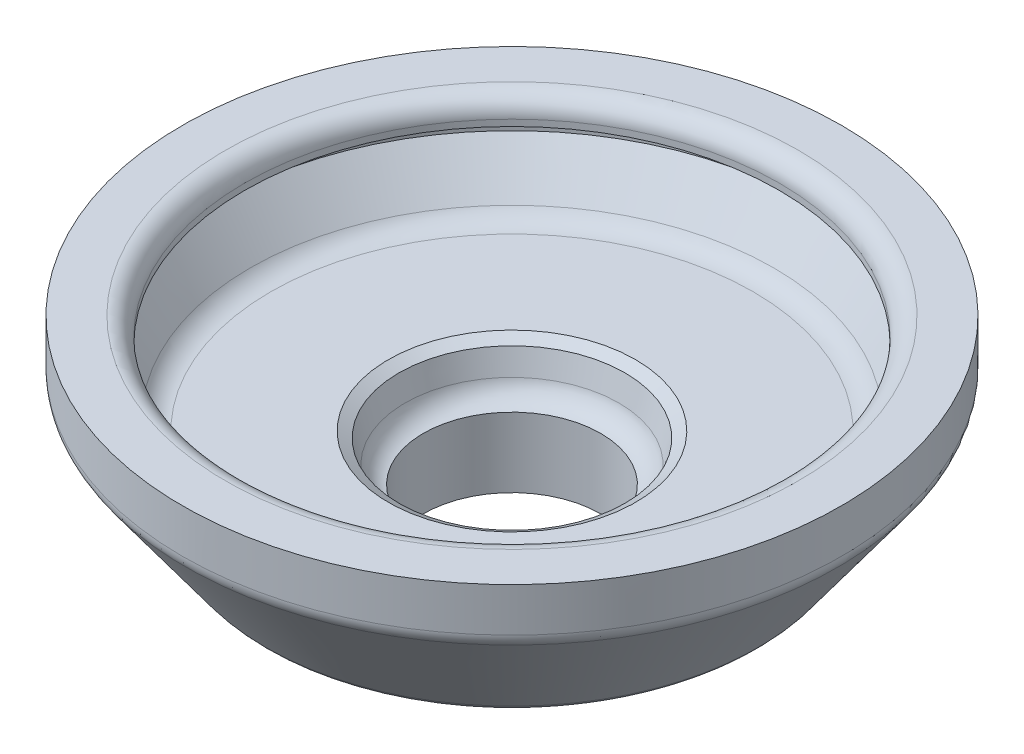
ISO-10303-21;
HEADER;
FILE_DESCRIPTION(('STEP AP214'),'2;1');
FILE_NAME('part.step','',(''),(''),'','','');
FILE_SCHEMA(('AUTOMOTIVE_DESIGN { 1 0 10303 214 1 1 1 1 }'));
ENDSEC;
DATA;
#1=APPLICATION_CONTEXT('core data for automotive mechanical design processes');
#2=APPLICATION_PROTOCOL_DEFINITION('international standard','automotive_design',2000,#1);
#3=PRODUCT_CONTEXT('',#1,'mechanical');
#4=PRODUCT('Part','Part','',(#3));
#5=PRODUCT_RELATED_PRODUCT_CATEGORY('part','',(#4));
#6=PRODUCT_DEFINITION_FORMATION('','',#4);
#7=PRODUCT_DEFINITION_CONTEXT('part definition',#1,'design');
#8=PRODUCT_DEFINITION('design','',#6,#7);
#9=PRODUCT_DEFINITION_SHAPE('','',#8);
#10=(LENGTH_UNIT() NAMED_UNIT(*) SI_UNIT(.MILLI.,.METRE.));
#11=(NAMED_UNIT(*) PLANE_ANGLE_UNIT() SI_UNIT($,.RADIAN.));
#12=(NAMED_UNIT(*) SI_UNIT($,.STERADIAN.) SOLID_ANGLE_UNIT());
#13=UNCERTAINTY_MEASURE_WITH_UNIT(LENGTH_MEASURE(1.E-05),#10,'distance_accuracy_value','');
#14=(GEOMETRIC_REPRESENTATION_CONTEXT(3) GLOBAL_UNCERTAINTY_ASSIGNED_CONTEXT((#13)) GLOBAL_UNIT_ASSIGNED_CONTEXT((#10,
#11,#12)) REPRESENTATION_CONTEXT('',''));
#15=CARTESIAN_POINT('',(0.,0.,0.));
#16=DIRECTION('',(0.,0.,1.));
#17=DIRECTION('',(1.,0.,0.));
#18=AXIS2_PLACEMENT_3D('',#15,#16,#17);
#19=CARTESIAN_POINT('',(-0.00251993502765717,10.2500265590013,0.));
#20=DIRECTION('',(0.,-1.,0.));
#21=DIRECTION('',(0.,0.,-1.));
#22=AXIS2_PLACEMENT_3D('',#19,#20,#21);
#23=TOROIDAL_SURFACE('',#22,3.2978087736099,0.950029759863165);
#24=CARTESIAN_POINT('',(-0.00251993502765717,10.0041406776896,0.));
#25=DIRECTION('',(0.,-1.,0.));
#26=DIRECTION('',(0.,0.,-1.));
#27=AXIS2_PLACEMENT_3D('',#24,#25,#26);
#28=CIRCLE('',#27,4.21546703134927);
#29=CARTESIAN_POINT('',(-0.00251993502765717,10.0041406776896,-4.21546703134927));
#30=VERTEX_POINT('',#29);
#31=EDGE_CURVE('E89',#30,#30,#28,.T.);
#32=ORIENTED_EDGE('',*,*,#31,.F.);
#33=EDGE_LOOP('',(#32));
#34=FACE_BOUND('',#33,.T.);
#35=CARTESIAN_POINT('',(-0.00251993502765717,9.32176191322588,0.));
#36=DIRECTION('',(0.,-1.,0.));
#37=DIRECTION('',(0.,0.,-1.));
#38=AXIS2_PLACEMENT_3D('',#35,#36,#37);
#39=CIRCLE('',#38,3.5);
#40=CARTESIAN_POINT('',(-0.00251993502765717,9.32176191322588,-3.5));
#41=VERTEX_POINT('',#40);
#42=EDGE_CURVE('E107',#41,#41,#39,.T.);
#43=ORIENTED_EDGE('',*,*,#42,.T.);
#44=EDGE_LOOP('',(#43));
#45=FACE_BOUND('',#44,.T.);
#46=ADVANCED_FACE('F39',(#34,#45),#23,.F.);
#47=CARTESIAN_POINT('',(-0.00251993502765717,10.0041406776896,0.));
#48=DIRECTION('',(0.,1.,0.));
#49=DIRECTION('',(0.,0.,1.));
#50=AXIS2_PLACEMENT_3D('',#47,#48,#49);
#51=CONICAL_SURFACE('',#50,4.21546703134927,0.261799481564869);
#52=CARTESIAN_POINT('',(-0.00251993502765717,10.9106206548614,0.));
#53=DIRECTION('',(0.,-1.,0.));
#54=DIRECTION('',(0.,0.,-1.));
#55=AXIS2_PLACEMENT_3D('',#52,#53,#54);
#56=CIRCLE('',#55,4.45835770028667);
#57=CARTESIAN_POINT('',(-0.00251993502765717,10.9106206548614,-4.45835770028667));
#58=VERTEX_POINT('',#57);
#59=EDGE_CURVE('E50',#58,#58,#56,.F.);
#60=ORIENTED_EDGE('',*,*,#59,.T.);
#61=EDGE_LOOP('',(#60));
#62=FACE_BOUND('',#61,.T.);
#63=ORIENTED_EDGE('',*,*,#31,.T.);
#64=EDGE_LOOP('',(#63));
#65=FACE_BOUND('',#64,.T.);
#66=ADVANCED_FACE('F130',(#62,#65),#51,.F.);
#67=CARTESIAN_POINT('',(-10.0255824192326,11.1521021053666,0.));
#68=DIRECTION('',(0.,-1.,0.));
#69=DIRECTION('',(0.,0.,-1.));
#70=AXIS2_PLACEMENT_3D('',#67,#68,#69);
#71=PLANE('',#70);
#72=CARTESIAN_POINT('',(-0.00251993502765717,11.1521021053666,0.));
#73=DIRECTION('',(0.,-1.,0.));
#74=DIRECTION('',(0.,0.,-1.));
#75=AXIS2_PLACEMENT_3D('',#72,#73,#74);
#76=CIRCLE('',#75,4.8766159322178);
#77=CARTESIAN_POINT('',(-0.00251993502765717,11.1521021053666,-4.8766159322178));
#78=VERTEX_POINT('',#77);
#79=EDGE_CURVE('E54',#78,#78,#76,.T.);
#80=ORIENTED_EDGE('',*,*,#79,.T.);
#81=EDGE_LOOP('',(#80));
#82=FACE_BOUND('',#81,.T.);
#83=CARTESIAN_POINT('',(-0.00251993502765717,11.1521021053666,0.));
#84=DIRECTION('',(0.,-1.,0.));
#85=DIRECTION('',(0.,0.,-1.));
#86=AXIS2_PLACEMENT_3D('',#83,#84,#85);
#87=CIRCLE('',#86,9.51427070773984);
#88=CARTESIAN_POINT('',(-0.00251993502765717,11.1521021053666,-9.51427070773984));
#89=VERTEX_POINT('',#88);
#90=EDGE_CURVE('E59',#89,#89,#87,.F.);
#91=ORIENTED_EDGE('',*,*,#90,.T.);
#92=EDGE_LOOP('',(#91));
#93=FACE_BOUND('',#92,.T.);
#94=ADVANCED_FACE('F137',(#82,#93),#71,.F.);
#95=CARTESIAN_POINT('',(-0.00251993502765717,11.1521021053666,0.));
#96=DIRECTION('',(0.,1.,0.));
#97=DIRECTION('',(0.,0.,1.));
#98=AXIS2_PLACEMENT_3D('',#95,#96,#97);
#99=CONICAL_SURFACE('',#98,10.023062484205,0.629483791624657);
#100=CARTESIAN_POINT('',(-0.00251993502765717,11.5633745364681,0.));
#101=DIRECTION('',(0.,1.,0.));
#102=DIRECTION('',(0.,0.,1.));
#103=AXIS2_PLACEMENT_3D('',#100,#101,#102);
#104=CIRCLE('',#103,10.3226022298388);
#105=CARTESIAN_POINT('',(-0.00251993502765717,11.5633745364681,10.3226022298388));
#106=VERTEX_POINT('',#105);
#107=EDGE_CURVE('E62',#106,#106,#104,.F.);
#108=ORIENTED_EDGE('',*,*,#107,.T.);
#109=EDGE_LOOP('',(#108));
#110=FACE_BOUND('',#109,.T.);
#111=CARTESIAN_POINT('',(-0.00251993502765717,13.2451496344329,0.));
#112=DIRECTION('',(0.,-1.,0.));
#113=DIRECTION('',(0.,0.,-1.));
#114=AXIS2_PLACEMENT_3D('',#111,#112,#113);
#115=CIRCLE('',#114,11.5474800649723);
#116=CARTESIAN_POINT('',(-0.00251993502765717,13.2451496344329,-11.5474800649723));
#117=VERTEX_POINT('',#116);
#118=EDGE_CURVE('E92',#117,#117,#115,.T.);
#119=ORIENTED_EDGE('',*,*,#118,.F.);
#120=EDGE_LOOP('',(#119));
#121=FACE_BOUND('',#120,.T.);
#122=ADVANCED_FACE('F176',(#110,#121),#99,.F.);
#123=CARTESIAN_POINT('',(-0.00251993502765717,0.,0.));
#124=DIRECTION('',(0.,-1.,0.));
#125=DIRECTION('',(0.,0.,-1.));
#126=AXIS2_PLACEMENT_3D('',#123,#124,#125);
#127=CYLINDRICAL_SURFACE('',#126,11.5474800649723);
#128=CARTESIAN_POINT('',(-0.00251993502765717,14.0951496344329,0.));
#129=DIRECTION('',(0.,-1.,0.));
#130=DIRECTION('',(0.,0.,-1.));
#131=AXIS2_PLACEMENT_3D('',#128,#129,#130);
#132=CIRCLE('',#131,11.5474800649723);
#133=CARTESIAN_POINT('',(-0.00251993502765717,14.0951496344329,-11.5474800649723));
#134=VERTEX_POINT('',#133);
#135=EDGE_CURVE('E95',#134,#134,#132,.T.);
#136=ORIENTED_EDGE('',*,*,#135,.F.);
#137=EDGE_LOOP('',(#136));
#138=FACE_BOUND('',#137,.T.);
#139=ORIENTED_EDGE('',*,*,#118,.T.);
#140=EDGE_LOOP('',(#139));
#141=FACE_BOUND('',#140,.T.);
#142=ADVANCED_FACE('F183',(#138,#141),#127,.F.);
#143=CARTESIAN_POINT('',(-10.55,14.0951496344329,0.));
#144=DIRECTION('',(0.,1.,0.));
#145=DIRECTION('',(0.,0.,1.));
#146=AXIS2_PLACEMENT_3D('',#143,#144,#145);
#147=PLANE('',#146);
#148=CARTESIAN_POINT('',(-0.00251993502765717,14.0951496344329,0.));
#149=DIRECTION('',(0.,-1.,0.));
#150=DIRECTION('',(0.,0.,-1.));
#151=AXIS2_PLACEMENT_3D('',#148,#149,#150);
#152=CIRCLE('',#151,10.5474800649723);
#153=CARTESIAN_POINT('',(-0.00251993502765717,14.0951496344329,-10.5474800649723));
#154=VERTEX_POINT('',#153);
#155=EDGE_CURVE('E98',#154,#154,#152,.T.);
#156=ORIENTED_EDGE('',*,*,#155,.F.);
#157=EDGE_LOOP('',(#156));
#158=FACE_BOUND('',#157,.T.);
#159=ORIENTED_EDGE('',*,*,#135,.T.);
#160=EDGE_LOOP('',(#159));
#161=FACE_BOUND('',#160,.T.);
#162=ADVANCED_FACE('F187',(#158,#161),#147,.F.);
#163=CARTESIAN_POINT('',(-0.00251993502765717,0.,0.));
#164=DIRECTION('',(0.,-1.,0.));
#165=DIRECTION('',(0.,0.,-1.));
#166=AXIS2_PLACEMENT_3D('',#163,#164,#165);
#167=CYLINDRICAL_SURFACE('',#166,10.5474800649723);
#168=CARTESIAN_POINT('',(-0.00251993502765717,14.3451496344329,0.));
#169=DIRECTION('',(0.,-1.,0.));
#170=DIRECTION('',(0.,0.,-1.));
#171=AXIS2_PLACEMENT_3D('',#168,#169,#170);
#172=CIRCLE('',#171,10.5474800649723);
#173=CARTESIAN_POINT('',(-0.00251993502765717,14.3451496344329,-10.5474800649723));
#174=VERTEX_POINT('',#173);
#175=EDGE_CURVE('E65',#174,#174,#172,.F.);
#176=ORIENTED_EDGE('',*,*,#175,.T.);
#177=EDGE_LOOP('',(#176));
#178=FACE_BOUND('',#177,.T.);
#179=ORIENTED_EDGE('',*,*,#155,.T.);
#180=EDGE_LOOP('',(#179));
#181=FACE_BOUND('',#180,.T.);
#182=ADVANCED_FACE('F193',(#178,#181),#167,.F.);
#183=CARTESIAN_POINT('',(-13.,15.0951496344329,0.));
#184=DIRECTION('',(0.,-1.,0.));
#185=DIRECTION('',(0.,0.,-1.));
#186=AXIS2_PLACEMENT_3D('',#183,#184,#185);
#187=PLANE('',#186);
#188=CARTESIAN_POINT('',(-0.00251993502765717,15.0951496344329,0.));
#189=DIRECTION('',(0.,-1.,0.));
#190=DIRECTION('',(0.,0.,-1.));
#191=AXIS2_PLACEMENT_3D('',#188,#189,#190);
#192=CIRCLE('',#191,11.2974800649723);
#193=CARTESIAN_POINT('',(-0.00251993502765717,15.0951496344329,-11.2974800649723));
#194=VERTEX_POINT('',#193);
#195=EDGE_CURVE('E68',#194,#194,#192,.T.);
#196=ORIENTED_EDGE('',*,*,#195,.T.);
#197=EDGE_LOOP('',(#196));
#198=FACE_BOUND('',#197,.T.);
#199=CARTESIAN_POINT('',(-0.00251993502765717,15.0951496344329,0.));
#200=DIRECTION('',(0.,-1.,0.));
#201=DIRECTION('',(0.,0.,-1.));
#202=AXIS2_PLACEMENT_3D('',#199,#200,#201);
#203=CIRCLE('',#202,12.9974800649723);
#204=CARTESIAN_POINT('',(-0.00251993502765717,15.0951496344329,-12.9974800649723));
#205=VERTEX_POINT('',#204);
#206=EDGE_CURVE('E101',#205,#205,#203,.T.);
#207=ORIENTED_EDGE('',*,*,#206,.F.);
#208=EDGE_LOOP('',(#207));
#209=FACE_BOUND('',#208,.T.);
#210=ADVANCED_FACE('F200',(#198,#209),#187,.F.);
#211=CARTESIAN_POINT('',(-0.00251993502765717,0.,0.));
#212=DIRECTION('',(0.,-1.,0.));
#213=DIRECTION('',(0.,0.,-1.));
#214=AXIS2_PLACEMENT_3D('',#211,#212,#213);
#215=CYLINDRICAL_SURFACE('',#214,12.9974800649723);
#216=CARTESIAN_POINT('',(-0.00251993502765717,13.3680259236142,0.));
#217=DIRECTION('',(0.,1.,0.));
#218=DIRECTION('',(0.,0.,1.));
#219=AXIS2_PLACEMENT_3D('',#216,#217,#218);
#220=CIRCLE('',#219,12.9974800649723);
#221=CARTESIAN_POINT('',(-0.00251993502765717,13.3680259236142,12.9974800649723));
#222=VERTEX_POINT('',#221);
#223=EDGE_CURVE('E71',#222,#222,#220,.T.);
#224=ORIENTED_EDGE('',*,*,#223,.T.);
#225=EDGE_LOOP('',(#224));
#226=FACE_BOUND('',#225,.T.);
#227=ORIENTED_EDGE('',*,*,#206,.T.);
#228=EDGE_LOOP('',(#227));
#229=FACE_BOUND('',#228,.T.);
#230=ADVANCED_FACE('F204',(#226,#229),#215,.T.);
#231=CARTESIAN_POINT('',(-0.00251993502765717,13.1238529546215,0.));
#232=DIRECTION('',(0.,1.,0.));
#233=DIRECTION('',(0.,0.,1.));
#234=AXIS2_PLACEMENT_3D('',#231,#232,#233);
#235=CONICAL_SURFACE('',#234,12.9974800649723,0.629483791624657);
#236=CARTESIAN_POINT('',(-0.00251993502765717,8.63021623655202,0.));
#237=DIRECTION('',(0.,-1.,0.));
#238=DIRECTION('',(0.,0.,-1.));
#239=AXIS2_PLACEMENT_3D('',#236,#237,#238);
#240=CIRCLE('',#239,9.7246548092254);
#241=CARTESIAN_POINT('',(-0.00251993502765717,8.63021623655202,-9.7246548092254));
#242=VERTEX_POINT('',#241);
#243=EDGE_CURVE('E74',#242,#242,#240,.F.);
#244=ORIENTED_EDGE('',*,*,#243,.T.);
#245=EDGE_LOOP('',(#244));
#246=FACE_BOUND('',#245,.T.);
#247=CARTESIAN_POINT('',(-0.00251993502765717,12.9264802469403,0.));
#248=DIRECTION('',(0.,-1.,0.));
#249=DIRECTION('',(0.,0.,-1.));
#250=AXIS2_PLACEMENT_3D('',#247,#248,#249);
#251=CIRCLE('',#250,12.8537287065466);
#252=CARTESIAN_POINT('',(-0.00251993502765717,12.9264802469403,-12.8537287065466));
#253=VERTEX_POINT('',#252);
#254=EDGE_CURVE('E77',#253,#253,#251,.T.);
#255=ORIENTED_EDGE('',*,*,#254,.T.);
#256=EDGE_LOOP('',(#255));
#257=FACE_BOUND('',#256,.T.);
#258=ADVANCED_FACE('F208',(#246,#257),#235,.T.);
#259=CARTESIAN_POINT('',(-4.50251993502766,8.32176191322588,0.));
#260=DIRECTION('',(0.,1.,0.));
#261=DIRECTION('',(0.,0.,1.));
#262=AXIS2_PLACEMENT_3D('',#259,#260,#261);
#263=PLANE('',#262);
#264=CARTESIAN_POINT('',(-0.00251993502765717,8.32176191322588,0.));
#265=DIRECTION('',(0.,1.,0.));
#266=DIRECTION('',(0.,0.,1.));
#267=AXIS2_PLACEMENT_3D('',#264,#265,#266);
#268=CIRCLE('',#267,5.25);
#269=CARTESIAN_POINT('',(-0.00251993502765717,8.32176191322588,5.25));
#270=VERTEX_POINT('',#269);
#271=EDGE_CURVE('E80',#270,#270,#268,.T.);
#272=ORIENTED_EDGE('',*,*,#271,.T.);
#273=EDGE_LOOP('',(#272));
#274=FACE_BOUND('',#273,.T.);
#275=CARTESIAN_POINT('',(-0.00251993502765717,8.32176191322588,0.));
#276=DIRECTION('',(0.,1.,0.));
#277=DIRECTION('',(0.,0.,1.));
#278=AXIS2_PLACEMENT_3D('',#275,#276,#277);
#279=CIRCLE('',#278,9.11840616765114);
#280=CARTESIAN_POINT('',(-0.00251993502765717,8.32176191322588,9.11840616765114));
#281=VERTEX_POINT('',#280);
#282=EDGE_CURVE('E83',#281,#281,#279,.F.);
#283=ORIENTED_EDGE('',*,*,#282,.T.);
#284=EDGE_LOOP('',(#283));
#285=FACE_BOUND('',#284,.T.);
#286=ADVANCED_FACE('F127',(#274,#285),#263,.F.);
#287=CARTESIAN_POINT('',(-0.00251993502765717,0.,0.));
#288=DIRECTION('',(0.,-1.,0.));
#289=DIRECTION('',(0.,0.,-1.));
#290=AXIS2_PLACEMENT_3D('',#287,#288,#289);
#291=CYLINDRICAL_SURFACE('',#290,4.5);
#292=CARTESIAN_POINT('',(-0.00251993502765717,6.78176191322588,0.));
#293=DIRECTION('',(0.,1.,0.));
#294=DIRECTION('',(0.,0.,1.));
#295=AXIS2_PLACEMENT_3D('',#292,#293,#294);
#296=CIRCLE('',#295,4.5);
#297=CARTESIAN_POINT('',(-0.00251993502765717,6.78176191322588,4.5));
#298=VERTEX_POINT('',#297);
#299=EDGE_CURVE('E10',#298,#298,#296,.T.);
#300=ORIENTED_EDGE('',*,*,#299,.T.);
#301=EDGE_LOOP('',(#300));
#302=FACE_BOUND('',#301,.T.);
#303=CARTESIAN_POINT('',(-0.00251993502765717,7.57176191322588,0.));
#304=DIRECTION('',(0.,1.,0.));
#305=DIRECTION('',(0.,0.,1.));
#306=AXIS2_PLACEMENT_3D('',#303,#304,#305);
#307=CIRCLE('',#306,4.5);
#308=CARTESIAN_POINT('',(-0.00251993502765717,7.57176191322588,4.5));
#309=VERTEX_POINT('',#308);
#310=EDGE_CURVE('E86',#309,#309,#307,.F.);
#311=ORIENTED_EDGE('',*,*,#310,.T.);
#312=EDGE_LOOP('',(#311));
#313=FACE_BOUND('',#312,.T.);
#314=ADVANCED_FACE('F121',(#302,#313),#291,.T.);
#315=CARTESIAN_POINT('',(-4.50251993502766,6.57176191322588,0.));
#316=DIRECTION('',(0.,1.,0.));
#317=DIRECTION('',(0.,0.,1.));
#318=AXIS2_PLACEMENT_3D('',#315,#316,#317);
#319=PLANE('',#318);
#320=CARTESIAN_POINT('',(-0.00251993502765717,6.57176191322588,0.));
#321=DIRECTION('',(0.,1.,0.));
#322=DIRECTION('',(0.,0.,1.));
#323=AXIS2_PLACEMENT_3D('',#320,#321,#322);
#324=CIRCLE('',#323,4.29);
#325=CARTESIAN_POINT('',(-0.00251993502765717,6.57176191322588,4.29));
#326=VERTEX_POINT('',#325);
#327=EDGE_CURVE('E46',#326,#326,#324,.F.);
#328=ORIENTED_EDGE('',*,*,#327,.T.);
#329=EDGE_LOOP('',(#328));
#330=FACE_BOUND('',#329,.T.);
#331=CARTESIAN_POINT('',(-0.00251993502765717,6.57176191322588,0.));
#332=DIRECTION('',(0.,-1.,0.));
#333=DIRECTION('',(0.,0.,-1.));
#334=AXIS2_PLACEMENT_3D('',#331,#332,#333);
#335=CIRCLE('',#334,3.5);
#336=CARTESIAN_POINT('',(-0.00251993502765717,6.57176191322588,-3.5));
#337=VERTEX_POINT('',#336);
#338=EDGE_CURVE('E104',#337,#337,#335,.T.);
#339=ORIENTED_EDGE('',*,*,#338,.F.);
#340=EDGE_LOOP('',(#339));
#341=FACE_BOUND('',#340,.T.);
#342=ADVANCED_FACE('F116',(#330,#341),#319,.F.);
#343=CARTESIAN_POINT('',(-0.00251993502765717,0.,0.));
#344=DIRECTION('',(0.,-1.,0.));
#345=DIRECTION('',(0.,0.,-1.));
#346=AXIS2_PLACEMENT_3D('',#343,#344,#345);
#347=CYLINDRICAL_SURFACE('',#346,3.5);
#348=ORIENTED_EDGE('',*,*,#42,.F.);
#349=EDGE_LOOP('',(#348));
#350=FACE_BOUND('',#349,.T.);
#351=ORIENTED_EDGE('',*,*,#338,.T.);
#352=EDGE_LOOP('',(#351));
#353=FACE_BOUND('',#352,.T.);
#354=ADVANCED_FACE('F112',(#350,#353),#347,.F.);
#355=CARTESIAN_POINT('',(-0.00251993502765717,7.57176191322588,0.));
#356=DIRECTION('',(0.,1.,0.));
#357=DIRECTION('',(0.,0.,1.));
#358=AXIS2_PLACEMENT_3D('',#355,#356,#357);
#359=TOROIDAL_SURFACE('',#358,5.25,0.75);
#360=ORIENTED_EDGE('',*,*,#271,.F.);
#361=EDGE_LOOP('',(#360));
#362=FACE_BOUND('',#361,.T.);
#363=ORIENTED_EDGE('',*,*,#310,.F.);
#364=EDGE_LOOP('',(#363));
#365=FACE_BOUND('',#364,.T.);
#366=ADVANCED_FACE('F115',(#362,#365),#359,.F.);
#367=CARTESIAN_POINT('',(-0.00251993502765717,9.07176191322588,0.));
#368=DIRECTION('',(0.,1.,0.));
#369=DIRECTION('',(0.,0.,1.));
#370=AXIS2_PLACEMENT_3D('',#367,#368,#369);
#371=TOROIDAL_SURFACE('',#370,9.11840616765114,0.75);
#372=ORIENTED_EDGE('',*,*,#243,.F.);
#373=EDGE_LOOP('',(#372));
#374=FACE_BOUND('',#373,.T.);
#375=ORIENTED_EDGE('',*,*,#282,.F.);
#376=EDGE_LOOP('',(#375));
#377=FACE_BOUND('',#376,.T.);
#378=ADVANCED_FACE('F145',(#374,#377),#371,.T.);
#379=CARTESIAN_POINT('',(-0.00251993502765717,13.3680259236142,0.));
#380=DIRECTION('',(0.,1.,0.));
#381=DIRECTION('',(0.,0.,1.));
#382=AXIS2_PLACEMENT_3D('',#379,#380,#381);
#383=TOROIDAL_SURFACE('',#382,12.2474800649723,0.75);
#384=ORIENTED_EDGE('',*,*,#223,.F.);
#385=EDGE_LOOP('',(#384));
#386=FACE_BOUND('',#385,.T.);
#387=ORIENTED_EDGE('',*,*,#254,.F.);
#388=EDGE_LOOP('',(#387));
#389=FACE_BOUND('',#388,.T.);
#390=ADVANCED_FACE('F149',(#386,#389),#383,.T.);
#391=CARTESIAN_POINT('',(-0.00251993502765717,14.3451496344329,0.));
#392=DIRECTION('',(0.,-1.,0.));
#393=DIRECTION('',(0.,0.,-1.));
#394=AXIS2_PLACEMENT_3D('',#391,#392,#393);
#395=TOROIDAL_SURFACE('',#394,11.2974800649723,0.75);
#396=ORIENTED_EDGE('',*,*,#175,.F.);
#397=EDGE_LOOP('',(#396));
#398=FACE_BOUND('',#397,.T.);
#399=ORIENTED_EDGE('',*,*,#195,.F.);
#400=EDGE_LOOP('',(#399));
#401=FACE_BOUND('',#400,.T.);
#402=ADVANCED_FACE('F153',(#398,#401),#395,.T.);
#403=CARTESIAN_POINT('',(-0.00251993502765717,12.1521021053666,0.));
#404=DIRECTION('',(0.,-1.,0.));
#405=DIRECTION('',(0.,0.,-1.));
#406=AXIS2_PLACEMENT_3D('',#403,#404,#405);
#407=TOROIDAL_SURFACE('',#406,9.51427070773984,1.);
#408=ORIENTED_EDGE('',*,*,#90,.F.);
#409=EDGE_LOOP('',(#408));
#410=FACE_BOUND('',#409,.T.);
#411=ORIENTED_EDGE('',*,*,#107,.F.);
#412=EDGE_LOOP('',(#411));
#413=FACE_BOUND('',#412,.T.);
#414=ADVANCED_FACE('F157',(#410,#413),#407,.F.);
#415=CARTESIAN_POINT('',(-0.00251993502765717,11.1521021053666,0.));
#416=DIRECTION('',(0.,1.,0.));
#417=DIRECTION('',(0.,0.,1.));
#418=AXIS2_PLACEMENT_3D('',#415,#416,#417);
#419=CONICAL_SURFACE('',#418,4.8766159322178,1.04719764496231);
#420=ORIENTED_EDGE('',*,*,#59,.F.);
#421=EDGE_LOOP('',(#420));
#422=FACE_BOUND('',#421,.T.);
#423=ORIENTED_EDGE('',*,*,#79,.F.);
#424=EDGE_LOOP('',(#423));
#425=FACE_BOUND('',#424,.T.);
#426=ADVANCED_FACE('F160',(#422,#425),#419,.F.);
#427=CARTESIAN_POINT('',(-0.00251993502765717,6.78176191322588,0.));
#428=DIRECTION('',(0.,1.,0.));
#429=DIRECTION('',(0.,0.,1.));
#430=AXIS2_PLACEMENT_3D('',#427,#428,#429);
#431=TOROIDAL_SURFACE('',#430,4.29,0.21);
#432=ORIENTED_EDGE('',*,*,#299,.F.);
#433=EDGE_LOOP('',(#432));
#434=FACE_BOUND('',#433,.T.);
#435=ORIENTED_EDGE('',*,*,#327,.F.);
#436=EDGE_LOOP('',(#435));
#437=FACE_BOUND('',#436,.T.);
#438=ADVANCED_FACE('F41',(#434,#437),#431,.T.);
#439=CLOSED_SHELL('',(#46,#66,#94,#122,#142,#162,#182,#210,#230,#258,#286,#314,#342,#354,#366,
#378,#390,#402,#414,#426,#438));
#440=MANIFOLD_SOLID_BREP('B2',#439);
#441=ADVANCED_BREP_SHAPE_REPRESENTATION('',(#18,#440),#14);
#442=SHAPE_DEFINITION_REPRESENTATION(#9,#441);
ENDSEC;
END-ISO-10303-21;
